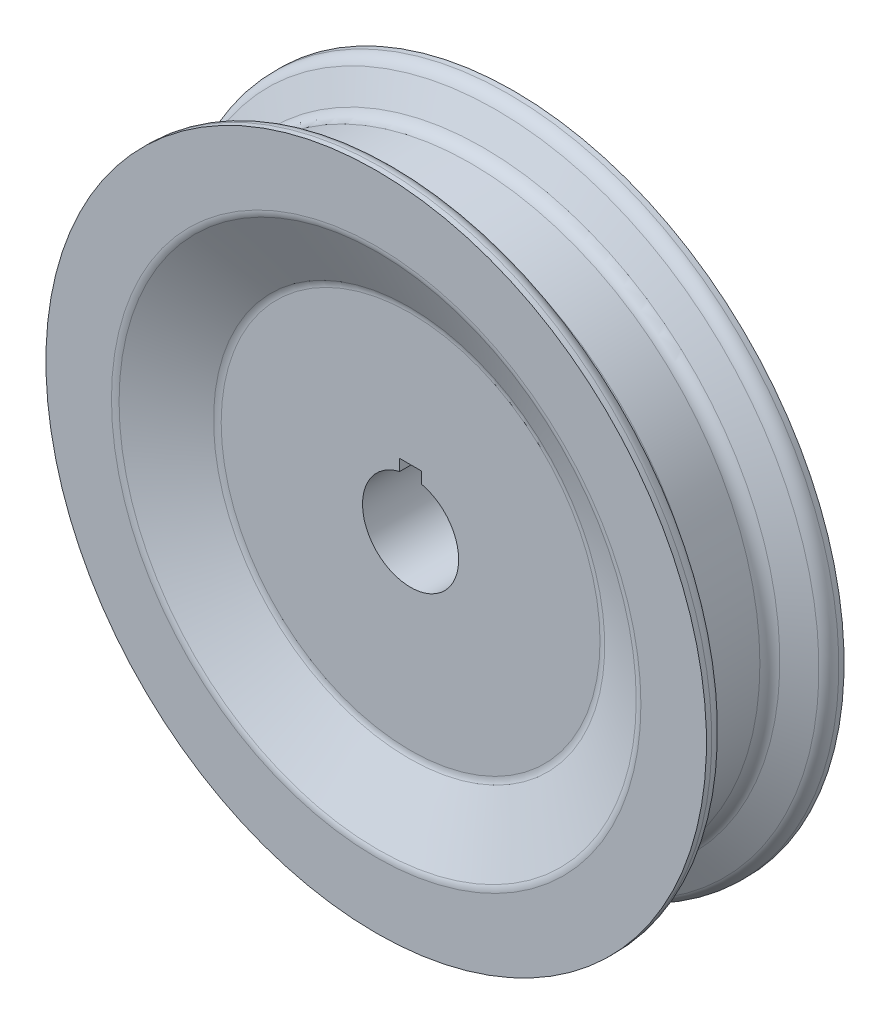
ISO-10303-21;
HEADER;
FILE_DESCRIPTION(('STEP AP214'),'2;1');
FILE_NAME('part.step','',(''),(''),'','','');
FILE_SCHEMA(('AUTOMOTIVE_DESIGN { 1 0 10303 214 1 1 1 1 }'));
ENDSEC;
DATA;
#1=APPLICATION_CONTEXT('core data for automotive mechanical design processes');
#2=APPLICATION_PROTOCOL_DEFINITION('international standard','automotive_design',2000,#1);
#3=PRODUCT_CONTEXT('',#1,'mechanical');
#4=PRODUCT('Part','Part','',(#3));
#5=PRODUCT_RELATED_PRODUCT_CATEGORY('part','',(#4));
#6=PRODUCT_DEFINITION_FORMATION('','',#4);
#7=PRODUCT_DEFINITION_CONTEXT('part definition',#1,'design');
#8=PRODUCT_DEFINITION('design','',#6,#7);
#9=PRODUCT_DEFINITION_SHAPE('','',#8);
#10=(LENGTH_UNIT() NAMED_UNIT(*) SI_UNIT(.MILLI.,.METRE.));
#11=(NAMED_UNIT(*) PLANE_ANGLE_UNIT() SI_UNIT($,.RADIAN.));
#12=(NAMED_UNIT(*) SI_UNIT($,.STERADIAN.) SOLID_ANGLE_UNIT());
#13=UNCERTAINTY_MEASURE_WITH_UNIT(LENGTH_MEASURE(1.E-05),#10,'distance_accuracy_value','');
#14=(GEOMETRIC_REPRESENTATION_CONTEXT(3) GLOBAL_UNCERTAINTY_ASSIGNED_CONTEXT((#13)) GLOBAL_UNIT_ASSIGNED_CONTEXT((#10,
#11,#12)) REPRESENTATION_CONTEXT('',''));
#15=CARTESIAN_POINT('',(0.,0.,0.));
#16=DIRECTION('',(0.,0.,1.));
#17=DIRECTION('',(1.,0.,0.));
#18=AXIS2_PLACEMENT_3D('',#15,#16,#17);
#19=CARTESIAN_POINT('',(0.,0.,12.5));
#20=DIRECTION('',(0.,0.,1.));
#21=DIRECTION('',(0.,-1.,0.));
#22=AXIS2_PLACEMENT_3D('',#19,#20,#21);
#23=CYLINDRICAL_SURFACE('',#22,120.);
#24=CARTESIAN_POINT('',(0.,0.,23.0901699437493));
#25=DIRECTION('',(0.,0.,-1.));
#26=DIRECTION('',(0.,1.,0.));
#27=AXIS2_PLACEMENT_3D('',#24,#25,#26);
#28=CIRCLE('',#27,120.);
#29=CARTESIAN_POINT('',(0.,120.,23.0901699437493));
#30=VERTEX_POINT('',#29);
#31=EDGE_CURVE('E93',#30,#30,#28,.F.);
#32=ORIENTED_EDGE('',*,*,#31,.T.);
#33=EDGE_LOOP('',(#32));
#34=FACE_BOUND('',#33,.T.);
#35=CARTESIAN_POINT('',(0.,0.,24.9999999999998));
#36=DIRECTION('',(0.,0.,1.));
#37=DIRECTION('',(0.,-1.,0.));
#38=AXIS2_PLACEMENT_3D('',#35,#36,#37);
#39=CIRCLE('',#38,120.);
#40=CARTESIAN_POINT('',(0.,-120.,24.9999999999998));
#41=VERTEX_POINT('',#40);
#42=EDGE_CURVE('E138',#41,#41,#39,.T.);
#43=ORIENTED_EDGE('',*,*,#42,.F.);
#44=EDGE_LOOP('',(#43));
#45=FACE_BOUND('',#44,.T.);
#46=ADVANCED_FACE('F32',(#34,#45),#23,.T.);
#47=CARTESIAN_POINT('',(0.,120.,24.9999999999998));
#48=DIRECTION('',(0.,0.,-1.));
#49=DIRECTION('',(0.,1.,0.));
#50=AXIS2_PLACEMENT_3D('',#47,#48,#49);
#51=PLANE('',#50);
#52=CARTESIAN_POINT('',(0.,0.,24.9999999999998));
#53=DIRECTION('',(0.,0.,-1.));
#54=DIRECTION('',(0.,1.,0.));
#55=AXIS2_PLACEMENT_3D('',#52,#53,#54);
#56=CIRCLE('',#55,96.1803398874989);
#57=CARTESIAN_POINT('',(0.,96.1803398874989,24.9999999999998));
#58=VERTEX_POINT('',#57);
#59=EDGE_CURVE('E129',#58,#58,#56,.T.);
#60=ORIENTED_EDGE('',*,*,#59,.T.);
#61=EDGE_LOOP('',(#60));
#62=FACE_BOUND('',#61,.T.);
#63=ORIENTED_EDGE('',*,*,#42,.T.);
#64=EDGE_LOOP('',(#63));
#65=FACE_BOUND('',#64,.T.);
#66=ADVANCED_FACE('F188',(#62,#65),#51,.F.);
#67=CARTESIAN_POINT('',(0.,0.,24.9999999999998));
#68=DIRECTION('',(0.,0.,1.));
#69=DIRECTION('',(0.,-1.,0.));
#70=AXIS2_PLACEMENT_3D('',#67,#68,#69);
#71=CONICAL_SURFACE('',#70,95.,1.1071487177941);
#72=CARTESIAN_POINT('',(0.,0.,24.4721359549994));
#73=DIRECTION('',(0.,0.,-1.));
#74=DIRECTION('',(0.,1.,0.));
#75=AXIS2_PLACEMENT_3D('',#72,#73,#74);
#76=CIRCLE('',#75,93.9442719099992);
#77=CARTESIAN_POINT('',(0.,93.9442719099992,24.4721359549994));
#78=VERTEX_POINT('',#77);
#79=EDGE_CURVE('E132',#78,#78,#76,.F.);
#80=ORIENTED_EDGE('',*,*,#79,.T.);
#81=EDGE_LOOP('',(#80));
#82=FACE_BOUND('',#81,.T.);
#83=CARTESIAN_POINT('',(0.,0.,13.0278640450004));
#84=DIRECTION('',(0.,0.,1.));
#85=DIRECTION('',(0.,-1.,0.));
#86=AXIS2_PLACEMENT_3D('',#83,#84,#85);
#87=CIRCLE('',#86,71.0557280900008);
#88=CARTESIAN_POINT('',(0.,-71.0557280900008,13.0278640450004));
#89=VERTEX_POINT('',#88);
#90=EDGE_CURVE('E135',#89,#89,#87,.F.);
#91=ORIENTED_EDGE('',*,*,#90,.T.);
#92=EDGE_LOOP('',(#91));
#93=FACE_BOUND('',#92,.T.);
#94=ADVANCED_FACE('F166',(#82,#93),#71,.F.);
#95=CARTESIAN_POINT('',(0.,70.,12.5));
#96=DIRECTION('',(0.,0.,-1.));
#97=DIRECTION('',(0.,1.,0.));
#98=AXIS2_PLACEMENT_3D('',#95,#96,#97);
#99=PLANE('',#98);
#100=DIRECTION('',(0.,-1.,0.));
#101=VECTOR('',#100,1.);
#102=CARTESIAN_POINT('',(3.96874999999999,70.,12.5));
#103=LINE('',#102,#101);
#104=CARTESIAN_POINT('',(3.96875,21.1381064454677,12.5));
#105=VERTEX_POINT('',#104);
#106=CARTESIAN_POINT('',(3.96875,17.0055264454677,12.5));
#107=VERTEX_POINT('',#106);
#108=EDGE_CURVE('E147',#105,#107,#103,.T.);
#109=ORIENTED_EDGE('',*,*,#108,.T.);
#110=CARTESIAN_POINT('',(0.,0.,12.5));
#111=DIRECTION('',(0.,0.,-1.));
#112=DIRECTION('',(0.,1.,0.));
#113=AXIS2_PLACEMENT_3D('',#110,#111,#112);
#114=CIRCLE('',#113,17.4625);
#115=CARTESIAN_POINT('',(-3.96875,17.0055264454677,12.5));
#116=VERTEX_POINT('',#115);
#117=EDGE_CURVE('E144',#107,#116,#114,.T.);
#118=ORIENTED_EDGE('',*,*,#117,.T.);
#119=DIRECTION('',(0.,1.,0.));
#120=VECTOR('',#119,1.);
#121=CARTESIAN_POINT('',(-3.96874999999999,70.,12.5));
#122=LINE('',#121,#120);
#123=CARTESIAN_POINT('',(-3.96875,21.1381064454677,12.5));
#124=VERTEX_POINT('',#123);
#125=EDGE_CURVE('E151',#116,#124,#122,.T.);
#126=ORIENTED_EDGE('',*,*,#125,.T.);
#127=DIRECTION('',(1.,0.,0.));
#128=VECTOR('',#127,1.);
#129=CARTESIAN_POINT('',(0.,21.1381064454677,12.5));
#130=LINE('',#129,#128);
#131=EDGE_CURVE('E82',#124,#105,#130,.T.);
#132=ORIENTED_EDGE('',*,*,#131,.T.);
#133=EDGE_LOOP('',(#109,#118,#126,#132));
#134=FACE_BOUND('',#133,.T.);
#135=CARTESIAN_POINT('',(0.,0.,12.5));
#136=DIRECTION('',(0.,0.,-1.));
#137=DIRECTION('',(0.,1.,0.));
#138=AXIS2_PLACEMENT_3D('',#135,#136,#137);
#139=CIRCLE('',#138,68.8196601125011);
#140=CARTESIAN_POINT('',(0.,68.8196601125011,12.5));
#141=VERTEX_POINT('',#140);
#142=EDGE_CURVE('E126',#141,#141,#139,.F.);
#143=ORIENTED_EDGE('',*,*,#142,.T.);
#144=EDGE_LOOP('',(#143));
#145=FACE_BOUND('',#144,.T.);
#146=ADVANCED_FACE('F163',(#134,#145),#99,.F.);
#147=CARTESIAN_POINT('',(0.,70.,-12.5));
#148=DIRECTION('',(0.,0.,1.));
#149=DIRECTION('',(0.,-1.,0.));
#150=AXIS2_PLACEMENT_3D('',#147,#148,#149);
#151=PLANE('',#150);
#152=DIRECTION('',(0.,-1.,0.));
#153=VECTOR('',#152,1.);
#154=CARTESIAN_POINT('',(-3.96874999999999,70.,-12.5));
#155=LINE('',#154,#153);
#156=CARTESIAN_POINT('',(-3.96875,21.1381064454677,-12.5));
#157=VERTEX_POINT('',#156);
#158=CARTESIAN_POINT('',(-3.96875,17.0055264454677,-12.5));
#159=VERTEX_POINT('',#158);
#160=EDGE_CURVE('E70',#157,#159,#155,.T.);
#161=ORIENTED_EDGE('',*,*,#160,.T.);
#162=CARTESIAN_POINT('',(0.,0.,-12.5));
#163=DIRECTION('',(0.,0.,1.));
#164=DIRECTION('',(0.,-1.,0.));
#165=AXIS2_PLACEMENT_3D('',#162,#163,#164);
#166=CIRCLE('',#165,17.4625);
#167=CARTESIAN_POINT('',(3.96875,17.0055264454677,-12.5));
#168=VERTEX_POINT('',#167);
#169=EDGE_CURVE('E11',#159,#168,#166,.T.);
#170=ORIENTED_EDGE('',*,*,#169,.T.);
#171=DIRECTION('',(0.,1.,0.));
#172=VECTOR('',#171,1.);
#173=CARTESIAN_POINT('',(3.96874999999999,70.,-12.5));
#174=LINE('',#173,#172);
#175=CARTESIAN_POINT('',(3.96875,21.1381064454677,-12.5));
#176=VERTEX_POINT('',#175);
#177=EDGE_CURVE('E40',#168,#176,#174,.T.);
#178=ORIENTED_EDGE('',*,*,#177,.T.);
#179=DIRECTION('',(-1.,0.,0.));
#180=VECTOR('',#179,1.);
#181=CARTESIAN_POINT('',(0.,21.1381064454677,-12.5));
#182=LINE('',#181,#180);
#183=EDGE_CURVE('E74',#176,#157,#182,.T.);
#184=ORIENTED_EDGE('',*,*,#183,.T.);
#185=EDGE_LOOP('',(#161,#170,#178,#184));
#186=FACE_BOUND('',#185,.T.);
#187=CARTESIAN_POINT('',(0.,0.,-12.5));
#188=DIRECTION('',(0.,0.,1.));
#189=DIRECTION('',(0.,-1.,0.));
#190=AXIS2_PLACEMENT_3D('',#187,#188,#189);
#191=CIRCLE('',#190,68.8196601125011);
#192=CARTESIAN_POINT('',(0.,-68.8196601125011,-12.5));
#193=VERTEX_POINT('',#192);
#194=EDGE_CURVE('E114',#193,#193,#191,.F.);
#195=ORIENTED_EDGE('',*,*,#194,.T.);
#196=EDGE_LOOP('',(#195));
#197=FACE_BOUND('',#196,.T.);
#198=ADVANCED_FACE('F87',(#186,#197),#151,.F.);
#199=CARTESIAN_POINT('',(0.,0.,-12.5));
#200=DIRECTION('',(0.,0.,-1.));
#201=DIRECTION('',(0.,1.,0.));
#202=AXIS2_PLACEMENT_3D('',#199,#200,#201);
#203=CONICAL_SURFACE('',#202,70.,1.10714871779408);
#204=CARTESIAN_POINT('',(0.,0.,-24.4721359549998));
#205=DIRECTION('',(0.,0.,1.));
#206=DIRECTION('',(0.,-1.,0.));
#207=AXIS2_PLACEMENT_3D('',#204,#205,#206);
#208=CIRCLE('',#207,93.9442719099991);
#209=CARTESIAN_POINT('',(0.,-93.9442719099991,-24.4721359549998));
#210=VERTEX_POINT('',#209);
#211=EDGE_CURVE('E117',#210,#210,#208,.F.);
#212=ORIENTED_EDGE('',*,*,#211,.T.);
#213=EDGE_LOOP('',(#212));
#214=FACE_BOUND('',#213,.T.);
#215=CARTESIAN_POINT('',(0.,0.,-13.0278640450004));
#216=DIRECTION('',(0.,0.,-1.));
#217=DIRECTION('',(0.,1.,0.));
#218=AXIS2_PLACEMENT_3D('',#215,#216,#217);
#219=CIRCLE('',#218,71.0557280900009);
#220=CARTESIAN_POINT('',(0.,71.0557280900009,-13.0278640450004));
#221=VERTEX_POINT('',#220);
#222=EDGE_CURVE('E120',#221,#221,#219,.F.);
#223=ORIENTED_EDGE('',*,*,#222,.T.);
#224=EDGE_LOOP('',(#223));
#225=FACE_BOUND('',#224,.T.);
#226=ADVANCED_FACE('F203',(#214,#225),#203,.F.);
#227=CARTESIAN_POINT('',(0.,95.,-25.0000000000002));
#228=DIRECTION('',(0.,0.,1.));
#229=DIRECTION('',(0.,-1.,0.));
#230=AXIS2_PLACEMENT_3D('',#227,#228,#229);
#231=PLANE('',#230);
#232=CARTESIAN_POINT('',(0.,0.,-25.0000000000002));
#233=DIRECTION('',(0.,0.,1.));
#234=DIRECTION('',(0.,-1.,0.));
#235=AXIS2_PLACEMENT_3D('',#232,#233,#234);
#236=CIRCLE('',#235,96.180339887499);
#237=CARTESIAN_POINT('',(0.,-96.180339887499,-25.0000000000002));
#238=VERTEX_POINT('',#237);
#239=EDGE_CURVE('E123',#238,#238,#236,.T.);
#240=ORIENTED_EDGE('',*,*,#239,.T.);
#241=EDGE_LOOP('',(#240));
#242=FACE_BOUND('',#241,.T.);
#243=CARTESIAN_POINT('',(0.,0.,-25.0000000000002));
#244=DIRECTION('',(0.,0.,1.));
#245=DIRECTION('',(0.,-1.,0.));
#246=AXIS2_PLACEMENT_3D('',#243,#244,#245);
#247=CIRCLE('',#246,120.);
#248=CARTESIAN_POINT('',(0.,-120.,-25.0000000000002));
#249=VERTEX_POINT('',#248);
#250=EDGE_CURVE('E141',#249,#249,#247,.T.);
#251=ORIENTED_EDGE('',*,*,#250,.F.);
#252=EDGE_LOOP('',(#251));
#253=FACE_BOUND('',#252,.T.);
#254=ADVANCED_FACE('F206',(#242,#253),#231,.F.);
#255=CARTESIAN_POINT('',(0.,0.,12.5));
#256=DIRECTION('',(0.,0.,1.));
#257=DIRECTION('',(0.,-1.,0.));
#258=AXIS2_PLACEMENT_3D('',#255,#256,#257);
#259=CYLINDRICAL_SURFACE('',#258,120.);
#260=CARTESIAN_POINT('',(0.,0.,-23.0901699437496));
#261=DIRECTION('',(0.,0.,-1.));
#262=DIRECTION('',(0.,1.,0.));
#263=AXIS2_PLACEMENT_3D('',#260,#261,#262);
#264=CIRCLE('',#263,120.);
#265=CARTESIAN_POINT('',(0.,120.,-23.0901699437496));
#266=VERTEX_POINT('',#265);
#267=EDGE_CURVE('E75',#266,#266,#264,.T.);
#268=ORIENTED_EDGE('',*,*,#267,.T.);
#269=EDGE_LOOP('',(#268));
#270=FACE_BOUND('',#269,.T.);
#271=ORIENTED_EDGE('',*,*,#250,.T.);
#272=EDGE_LOOP('',(#271));
#273=FACE_BOUND('',#272,.T.);
#274=ADVANCED_FACE('F210',(#270,#273),#259,.T.);
#275=CARTESIAN_POINT('',(0.,0.,-20.0000000000002));
#276=DIRECTION('',(0.,0.,-1.));
#277=DIRECTION('',(0.,1.,0.));
#278=AXIS2_PLACEMENT_3D('',#275,#276,#277);
#279=CONICAL_SURFACE('',#278,120.,1.10714871779408);
#280=CARTESIAN_POINT('',(0.,0.,-13.8819660112501));
#281=DIRECTION('',(0.,0.,-1.));
#282=DIRECTION('',(0.,1.,0.));
#283=AXIS2_PLACEMENT_3D('',#280,#281,#282);
#284=CIRCLE('',#283,107.7639320225);
#285=CARTESIAN_POINT('',(0.,107.7639320225,-13.8819660112501));
#286=VERTEX_POINT('',#285);
#287=EDGE_CURVE('E96',#286,#286,#284,.T.);
#288=ORIENTED_EDGE('',*,*,#287,.T.);
#289=EDGE_LOOP('',(#288));
#290=FACE_BOUND('',#289,.T.);
#291=CARTESIAN_POINT('',(0.,0.,-18.6180339887501));
#292=DIRECTION('',(0.,0.,1.));
#293=DIRECTION('',(0.,-1.,0.));
#294=AXIS2_PLACEMENT_3D('',#291,#292,#293);
#295=CIRCLE('',#294,117.2360679775);
#296=CARTESIAN_POINT('',(0.,-117.2360679775,-18.6180339887501));
#297=VERTEX_POINT('',#296);
#298=EDGE_CURVE('E99',#297,#297,#295,.T.);
#299=ORIENTED_EDGE('',*,*,#298,.T.);
#300=EDGE_LOOP('',(#299));
#301=FACE_BOUND('',#300,.T.);
#302=ADVANCED_FACE('F214',(#290,#301),#279,.T.);
#303=CARTESIAN_POINT('',(0.,0.,12.5));
#304=DIRECTION('',(0.,0.,1.));
#305=DIRECTION('',(0.,-1.,0.));
#306=AXIS2_PLACEMENT_3D('',#303,#304,#305);
#307=CYLINDRICAL_SURFACE('',#306,105.);
#308=CARTESIAN_POINT('',(0.,0.,9.40983005625048));
#309=DIRECTION('',(0.,0.,1.));
#310=DIRECTION('',(0.,-1.,0.));
#311=AXIS2_PLACEMENT_3D('',#308,#309,#310);
#312=CIRCLE('',#311,105.);
#313=CARTESIAN_POINT('',(0.,-105.,9.40983005625047));
#314=VERTEX_POINT('',#313);
#315=EDGE_CURVE('E102',#314,#314,#312,.F.);
#316=ORIENTED_EDGE('',*,*,#315,.T.);
#317=EDGE_LOOP('',(#316));
#318=FACE_BOUND('',#317,.T.);
#319=CARTESIAN_POINT('',(0.,0.,-9.40983005625058));
#320=DIRECTION('',(0.,0.,1.));
#321=DIRECTION('',(0.,-1.,0.));
#322=AXIS2_PLACEMENT_3D('',#319,#320,#321);
#323=CIRCLE('',#322,105.);
#324=CARTESIAN_POINT('',(0.,-105.,-9.40983005625059));
#325=VERTEX_POINT('',#324);
#326=EDGE_CURVE('E105',#325,#325,#323,.T.);
#327=ORIENTED_EDGE('',*,*,#326,.T.);
#328=EDGE_LOOP('',(#327));
#329=FACE_BOUND('',#328,.T.);
#330=ADVANCED_FACE('F218',(#318,#329),#307,.T.);
#331=CARTESIAN_POINT('',(0.,0.,12.5));
#332=DIRECTION('',(0.,0.,1.));
#333=DIRECTION('',(0.,-1.,0.));
#334=AXIS2_PLACEMENT_3D('',#331,#332,#333);
#335=CONICAL_SURFACE('',#334,105.,1.1071487177941);
#336=CARTESIAN_POINT('',(0.,0.,13.8819660112501));
#337=DIRECTION('',(0.,0.,1.));
#338=DIRECTION('',(0.,-1.,0.));
#339=AXIS2_PLACEMENT_3D('',#336,#337,#338);
#340=CIRCLE('',#339,107.7639320225);
#341=CARTESIAN_POINT('',(0.,-107.7639320225,13.8819660112501));
#342=VERTEX_POINT('',#341);
#343=EDGE_CURVE('E108',#342,#342,#340,.T.);
#344=ORIENTED_EDGE('',*,*,#343,.T.);
#345=EDGE_LOOP('',(#344));
#346=FACE_BOUND('',#345,.T.);
#347=CARTESIAN_POINT('',(0.,0.,18.6180339887497));
#348=DIRECTION('',(0.,0.,-1.));
#349=DIRECTION('',(0.,1.,0.));
#350=AXIS2_PLACEMENT_3D('',#347,#348,#349);
#351=CIRCLE('',#350,117.2360679775);
#352=CARTESIAN_POINT('',(0.,117.2360679775,18.6180339887497));
#353=VERTEX_POINT('',#352);
#354=EDGE_CURVE('E111',#353,#353,#351,.T.);
#355=ORIENTED_EDGE('',*,*,#354,.T.);
#356=EDGE_LOOP('',(#355));
#357=FACE_BOUND('',#356,.T.);
#358=ADVANCED_FACE('F183',(#346,#357),#335,.T.);
#359=CARTESIAN_POINT('',(0.,0.,19.9999999999998));
#360=DIRECTION('',(0.,0.,-1.));
#361=DIRECTION('',(0.,1.,0.));
#362=AXIS2_PLACEMENT_3D('',#359,#360,#361);
#363=TOROIDAL_SURFACE('',#362,96.1803398874989,5.);
#364=ORIENTED_EDGE('',*,*,#59,.F.);
#365=EDGE_LOOP('',(#364));
#366=FACE_BOUND('',#365,.T.);
#367=ORIENTED_EDGE('',*,*,#79,.F.);
#368=EDGE_LOOP('',(#367));
#369=FACE_BOUND('',#368,.T.);
#370=ADVANCED_FACE('F173',(#366,#369),#363,.T.);
#371=CARTESIAN_POINT('',(0.,0.,17.5));
#372=DIRECTION('',(0.,0.,-1.));
#373=DIRECTION('',(0.,1.,0.));
#374=AXIS2_PLACEMENT_3D('',#371,#372,#373);
#375=TOROIDAL_SURFACE('',#374,68.8196601125011,5.);
#376=ORIENTED_EDGE('',*,*,#90,.F.);
#377=EDGE_LOOP('',(#376));
#378=FACE_BOUND('',#377,.T.);
#379=ORIENTED_EDGE('',*,*,#142,.F.);
#380=EDGE_LOOP('',(#379));
#381=FACE_BOUND('',#380,.T.);
#382=ADVANCED_FACE('F170',(#378,#381),#375,.F.);
#383=CARTESIAN_POINT('',(0.,0.,-20.0000000000002));
#384=DIRECTION('',(0.,0.,1.));
#385=DIRECTION('',(0.,-1.,0.));
#386=AXIS2_PLACEMENT_3D('',#383,#384,#385);
#387=TOROIDAL_SURFACE('',#386,96.180339887499,5.);
#388=ORIENTED_EDGE('',*,*,#211,.F.);
#389=EDGE_LOOP('',(#388));
#390=FACE_BOUND('',#389,.T.);
#391=ORIENTED_EDGE('',*,*,#239,.F.);
#392=EDGE_LOOP('',(#391));
#393=FACE_BOUND('',#392,.T.);
#394=ADVANCED_FACE('F172',(#390,#393),#387,.T.);
#395=CARTESIAN_POINT('',(0.,0.,-17.5));
#396=DIRECTION('',(0.,0.,1.));
#397=DIRECTION('',(0.,-1.,0.));
#398=AXIS2_PLACEMENT_3D('',#395,#396,#397);
#399=TOROIDAL_SURFACE('',#398,68.8196601125011,5.);
#400=ORIENTED_EDGE('',*,*,#194,.F.);
#401=EDGE_LOOP('',(#400));
#402=FACE_BOUND('',#401,.T.);
#403=ORIENTED_EDGE('',*,*,#222,.F.);
#404=EDGE_LOOP('',(#403));
#405=FACE_BOUND('',#404,.T.);
#406=ADVANCED_FACE('F180',(#402,#405),#399,.F.);
#407=CARTESIAN_POINT('',(0.,0.,9.40983005625048));
#408=DIRECTION('',(0.,0.,1.));
#409=DIRECTION('',(0.,-1.,0.));
#410=AXIS2_PLACEMENT_3D('',#407,#408,#409);
#411=TOROIDAL_SURFACE('',#410,110.,5.);
#412=ORIENTED_EDGE('',*,*,#315,.F.);
#413=EDGE_LOOP('',(#412));
#414=FACE_BOUND('',#413,.T.);
#415=ORIENTED_EDGE('',*,*,#343,.F.);
#416=EDGE_LOOP('',(#415));
#417=FACE_BOUND('',#416,.T.);
#418=ADVANCED_FACE('F281',(#414,#417),#411,.F.);
#419=CARTESIAN_POINT('',(0.,0.,-9.40983005625058));
#420=DIRECTION('',(0.,0.,1.));
#421=DIRECTION('',(0.,-1.,0.));
#422=AXIS2_PLACEMENT_3D('',#419,#420,#421);
#423=TOROIDAL_SURFACE('',#422,110.,5.);
#424=ORIENTED_EDGE('',*,*,#287,.F.);
#425=EDGE_LOOP('',(#424));
#426=FACE_BOUND('',#425,.T.);
#427=ORIENTED_EDGE('',*,*,#326,.F.);
#428=EDGE_LOOP('',(#427));
#429=FACE_BOUND('',#428,.T.);
#430=ADVANCED_FACE('F273',(#426,#429),#423,.F.);
#431=CARTESIAN_POINT('',(0.,0.,23.0901699437493));
#432=DIRECTION('',(0.,0.,-1.));
#433=DIRECTION('',(0.,1.,0.));
#434=AXIS2_PLACEMENT_3D('',#431,#432,#433);
#435=TOROIDAL_SURFACE('',#434,115.,5.);
#436=ORIENTED_EDGE('',*,*,#354,.F.);
#437=EDGE_LOOP('',(#436));
#438=FACE_BOUND('',#437,.T.);
#439=ORIENTED_EDGE('',*,*,#31,.F.);
#440=EDGE_LOOP('',(#439));
#441=FACE_BOUND('',#440,.T.);
#442=ADVANCED_FACE('F264',(#438,#441),#435,.T.);
#443=CARTESIAN_POINT('',(0.,0.,-23.0901699437496));
#444=DIRECTION('',(0.,0.,-1.));
#445=DIRECTION('',(0.,1.,0.));
#446=AXIS2_PLACEMENT_3D('',#443,#444,#445);
#447=TOROIDAL_SURFACE('',#446,115.,5.);
#448=ORIENTED_EDGE('',*,*,#267,.F.);
#449=EDGE_LOOP('',(#448));
#450=FACE_BOUND('',#449,.T.);
#451=ORIENTED_EDGE('',*,*,#298,.F.);
#452=EDGE_LOOP('',(#451));
#453=FACE_BOUND('',#452,.T.);
#454=ADVANCED_FACE('F34',(#450,#453),#447,.T.);
#455=CARTESIAN_POINT('',(0.,0.,24.9999999999998));
#456=DIRECTION('',(0.,0.,-1.));
#457=DIRECTION('',(0.,1.,0.));
#458=AXIS2_PLACEMENT_3D('',#455,#456,#457);
#459=CYLINDRICAL_SURFACE('',#458,17.4625);
#460=DIRECTION('',(0.,0.,-1.));
#461=VECTOR('',#460,1.);
#462=CARTESIAN_POINT('',(3.96875,17.0055264454677,24.9999999999998));
#463=LINE('',#462,#461);
#464=EDGE_CURVE('E153',#107,#168,#463,.T.);
#465=ORIENTED_EDGE('',*,*,#464,.T.);
#466=ORIENTED_EDGE('',*,*,#169,.F.);
#467=DIRECTION('',(0.,0.,-1.));
#468=VECTOR('',#467,1.);
#469=CARTESIAN_POINT('',(-3.96875,17.0055264454677,24.9999999999998));
#470=LINE('',#469,#468);
#471=EDGE_CURVE('E52',#116,#159,#470,.T.);
#472=ORIENTED_EDGE('',*,*,#471,.F.);
#473=ORIENTED_EDGE('',*,*,#117,.F.);
#474=EDGE_LOOP('',(#465,#466,#472,#473));
#475=FACE_BOUND('',#474,.T.);
#476=ADVANCED_FACE('F159',(#475),#459,.F.);
#477=CARTESIAN_POINT('',(3.96875,17.0055264454677,24.9999999999998));
#478=DIRECTION('',(1.,0.,0.));
#479=DIRECTION('',(0.,1.,0.));
#480=AXIS2_PLACEMENT_3D('',#477,#478,#479);
#481=PLANE('',#480);
#482=DIRECTION('',(0.,0.,-1.));
#483=VECTOR('',#482,1.);
#484=CARTESIAN_POINT('',(3.96875,21.1381064454677,24.9999999999998));
#485=LINE('',#484,#483);
#486=EDGE_CURVE('E84',#105,#176,#485,.T.);
#487=ORIENTED_EDGE('',*,*,#486,.T.);
#488=ORIENTED_EDGE('',*,*,#177,.F.);
#489=ORIENTED_EDGE('',*,*,#464,.F.);
#490=ORIENTED_EDGE('',*,*,#108,.F.);
#491=EDGE_LOOP('',(#487,#488,#489,#490));
#492=FACE_BOUND('',#491,.T.);
#493=ADVANCED_FACE('F161',(#492),#481,.F.);
#494=CARTESIAN_POINT('',(3.96875,21.1381064454677,24.9999999999998));
#495=DIRECTION('',(0.,1.,0.));
#496=DIRECTION('',(0.,0.,1.));
#497=AXIS2_PLACEMENT_3D('',#494,#495,#496);
#498=PLANE('',#497);
#499=DIRECTION('',(0.,0.,-1.));
#500=VECTOR('',#499,1.);
#501=CARTESIAN_POINT('',(-3.96875,21.1381064454677,24.9999999999998));
#502=LINE('',#501,#500);
#503=EDGE_CURVE('E47',#124,#157,#502,.T.);
#504=ORIENTED_EDGE('',*,*,#503,.T.);
#505=ORIENTED_EDGE('',*,*,#183,.F.);
#506=ORIENTED_EDGE('',*,*,#486,.F.);
#507=ORIENTED_EDGE('',*,*,#131,.F.);
#508=EDGE_LOOP('',(#504,#505,#506,#507));
#509=FACE_BOUND('',#508,.T.);
#510=ADVANCED_FACE('F78',(#509),#498,.F.);
#511=CARTESIAN_POINT('',(-3.96875,21.1381064454677,24.9999999999998));
#512=DIRECTION('',(-1.,0.,0.));
#513=DIRECTION('',(0.,-1.,0.));
#514=AXIS2_PLACEMENT_3D('',#511,#512,#513);
#515=PLANE('',#514);
#516=ORIENTED_EDGE('',*,*,#471,.T.);
#517=ORIENTED_EDGE('',*,*,#160,.F.);
#518=ORIENTED_EDGE('',*,*,#503,.F.);
#519=ORIENTED_EDGE('',*,*,#125,.F.);
#520=EDGE_LOOP('',(#516,#517,#518,#519));
#521=FACE_BOUND('',#520,.T.);
#522=ADVANCED_FACE('F71',(#521),#515,.F.);
#523=CLOSED_SHELL('',(#46,#66,#94,#146,#198,#226,#254,#274,#302,#330,#358,#370,#382,#394,#406,
#418,#430,#442,#454,#476,#493,#510,#522));
#524=MANIFOLD_SOLID_BREP('B2',#523);
#525=ADVANCED_BREP_SHAPE_REPRESENTATION('',(#18,#524),#14);
#526=SHAPE_DEFINITION_REPRESENTATION(#9,#525);
ENDSEC;
END-ISO-10303-21;
